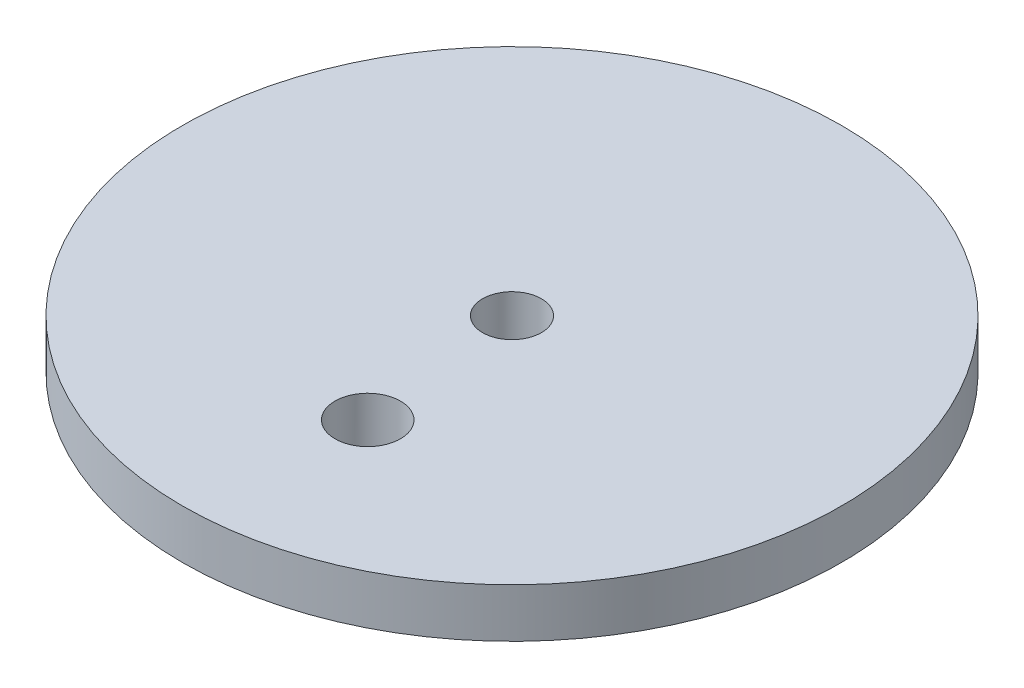
ISO-10303-21;
HEADER;
FILE_DESCRIPTION(('STEP AP214'),'2;1');
FILE_NAME('part.step','',(''),(''),'','','');
FILE_SCHEMA(('AUTOMOTIVE_DESIGN { 1 0 10303 214 1 1 1 1 }'));
ENDSEC;
DATA;
#1=APPLICATION_CONTEXT('core data for automotive mechanical design processes');
#2=APPLICATION_PROTOCOL_DEFINITION('international standard','automotive_design',2000,#1);
#3=PRODUCT_CONTEXT('',#1,'mechanical');
#4=PRODUCT('Part','Part','',(#3));
#5=PRODUCT_RELATED_PRODUCT_CATEGORY('part','',(#4));
#6=PRODUCT_DEFINITION_FORMATION('','',#4);
#7=PRODUCT_DEFINITION_CONTEXT('part definition',#1,'design');
#8=PRODUCT_DEFINITION('design','',#6,#7);
#9=PRODUCT_DEFINITION_SHAPE('','',#8);
#10=(LENGTH_UNIT() NAMED_UNIT(*) SI_UNIT(.MILLI.,.METRE.));
#11=(NAMED_UNIT(*) PLANE_ANGLE_UNIT() SI_UNIT($,.RADIAN.));
#12=(NAMED_UNIT(*) SI_UNIT($,.STERADIAN.) SOLID_ANGLE_UNIT());
#13=UNCERTAINTY_MEASURE_WITH_UNIT(LENGTH_MEASURE(1.E-05),#10,'distance_accuracy_value','');
#14=(GEOMETRIC_REPRESENTATION_CONTEXT(3) GLOBAL_UNCERTAINTY_ASSIGNED_CONTEXT((#13)) GLOBAL_UNIT_ASSIGNED_CONTEXT((#10,
#11,#12)) REPRESENTATION_CONTEXT('',''));
#15=CARTESIAN_POINT('',(0.,0.,0.));
#16=DIRECTION('',(0.,0.,1.));
#17=DIRECTION('',(1.,0.,0.));
#18=AXIS2_PLACEMENT_3D('',#15,#16,#17);
#19=CARTESIAN_POINT('',(20.1648867434263,9.39810199171115,0.));
#20=DIRECTION('',(0.,1.,0.));
#21=DIRECTION('',(0.,0.,1.));
#22=AXIS2_PLACEMENT_3D('',#19,#20,#21);
#23=PLANE('',#22);
#24=CARTESIAN_POINT('',(1.10990845996003,9.39810199171115,9.93821428680772));
#25=DIRECTION('',(0.,1.,0.));
#26=DIRECTION('',(0.,0.,1.));
#27=AXIS2_PLACEMENT_3D('',#24,#25,#26);
#28=CIRCLE('',#27,2.00310616677559);
#29=CARTESIAN_POINT('',(1.10990845996003,9.39810199171115,11.9413204535833));
#30=VERTEX_POINT('',#29);
#31=EDGE_CURVE('E50',#30,#30,#28,.T.);
#32=ORIENTED_EDGE('',*,*,#31,.F.);
#33=EDGE_LOOP('',(#32));
#34=FACE_BOUND('',#33,.T.);
#35=CARTESIAN_POINT('',(0.,9.39810199171116,0.));
#36=DIRECTION('',(0.,-1.,0.));
#37=DIRECTION('',(0.,0.,-1.));
#38=AXIS2_PLACEMENT_3D('',#35,#36,#37);
#39=CIRCLE('',#38,1.8);
#40=CARTESIAN_POINT('',(0.,9.39810199171116,-1.8));
#41=VERTEX_POINT('',#40);
#42=EDGE_CURVE('E10',#41,#41,#39,.T.);
#43=ORIENTED_EDGE('',*,*,#42,.T.);
#44=EDGE_LOOP('',(#43));
#45=FACE_BOUND('',#44,.T.);
#46=CARTESIAN_POINT('',(0.,9.39810199171114,0.));
#47=DIRECTION('',(0.,-1.,0.));
#48=DIRECTION('',(0.,0.,-1.));
#49=AXIS2_PLACEMENT_3D('',#46,#47,#48);
#50=CIRCLE('',#49,20.1648867434263);
#51=CARTESIAN_POINT('',(0.,9.39810199171114,-20.1648867434263));
#52=VERTEX_POINT('',#51);
#53=EDGE_CURVE('E47',#52,#52,#50,.T.);
#54=ORIENTED_EDGE('',*,*,#53,.F.);
#55=EDGE_LOOP('',(#54));
#56=FACE_BOUND('',#55,.T.);
#57=ADVANCED_FACE('F31',(#34,#45,#56),#23,.T.);
#58=CARTESIAN_POINT('',(0.,9.39810199171116,0.));
#59=DIRECTION('',(0.,-1.,0.));
#60=DIRECTION('',(0.,0.,-1.));
#61=AXIS2_PLACEMENT_3D('',#58,#59,#60);
#62=CYLINDRICAL_SURFACE('',#61,1.8);
#63=CARTESIAN_POINT('',(0.,6.39810199171116,0.));
#64=DIRECTION('',(0.,-1.,0.));
#65=DIRECTION('',(0.,0.,-1.));
#66=AXIS2_PLACEMENT_3D('',#63,#64,#65);
#67=CIRCLE('',#66,1.8);
#68=CARTESIAN_POINT('',(0.,6.39810199171116,-1.8));
#69=VERTEX_POINT('',#68);
#70=EDGE_CURVE('E38',#69,#69,#67,.T.);
#71=ORIENTED_EDGE('',*,*,#70,.T.);
#72=EDGE_LOOP('',(#71));
#73=FACE_BOUND('',#72,.T.);
#74=ORIENTED_EDGE('',*,*,#42,.F.);
#75=EDGE_LOOP('',(#74));
#76=FACE_BOUND('',#75,.T.);
#77=ADVANCED_FACE('F63',(#73,#76),#62,.F.);
#78=CARTESIAN_POINT('',(1.8,6.39810199171116,0.));
#79=DIRECTION('',(0.,-1.,0.));
#80=DIRECTION('',(0.,0.,-1.));
#81=AXIS2_PLACEMENT_3D('',#78,#79,#80);
#82=PLANE('',#81);
#83=CARTESIAN_POINT('',(1.10990845996003,6.39810199171116,9.93821428680772));
#84=DIRECTION('',(0.,-1.,0.));
#85=DIRECTION('',(0.,0.,-1.));
#86=AXIS2_PLACEMENT_3D('',#83,#84,#85);
#87=CIRCLE('',#86,2.00310616677559);
#88=CARTESIAN_POINT('',(1.10990845996003,6.39810199171116,7.93510812003213));
#89=VERTEX_POINT('',#88);
#90=EDGE_CURVE('E34',#89,#89,#87,.T.);
#91=ORIENTED_EDGE('',*,*,#90,.F.);
#92=EDGE_LOOP('',(#91));
#93=FACE_BOUND('',#92,.T.);
#94=CARTESIAN_POINT('',(0.,6.39810199171115,0.));
#95=DIRECTION('',(0.,-1.,0.));
#96=DIRECTION('',(0.,0.,-1.));
#97=AXIS2_PLACEMENT_3D('',#94,#95,#96);
#98=CIRCLE('',#97,20.1648867434263);
#99=CARTESIAN_POINT('',(0.,6.39810199171115,-20.1648867434263));
#100=VERTEX_POINT('',#99);
#101=EDGE_CURVE('E42',#100,#100,#98,.T.);
#102=ORIENTED_EDGE('',*,*,#101,.T.);
#103=EDGE_LOOP('',(#102));
#104=FACE_BOUND('',#103,.T.);
#105=ORIENTED_EDGE('',*,*,#70,.F.);
#106=EDGE_LOOP('',(#105));
#107=FACE_BOUND('',#106,.T.);
#108=ADVANCED_FACE('F59',(#93,#104,#107),#82,.T.);
#109=CARTESIAN_POINT('',(0.,9.39810199171116,0.));
#110=DIRECTION('',(0.,-1.,0.));
#111=DIRECTION('',(0.,0.,-1.));
#112=AXIS2_PLACEMENT_3D('',#109,#110,#111);
#113=CYLINDRICAL_SURFACE('',#112,20.1648867434263);
#114=ORIENTED_EDGE('',*,*,#53,.T.);
#115=EDGE_LOOP('',(#114));
#116=FACE_BOUND('',#115,.T.);
#117=ORIENTED_EDGE('',*,*,#101,.F.);
#118=EDGE_LOOP('',(#117));
#119=FACE_BOUND('',#118,.T.);
#120=ADVANCED_FACE('F62',(#116,#119),#113,.T.);
#121=CARTESIAN_POINT('',(1.10990845996003,-0.601898008288851,9.93821428680772));
#122=DIRECTION('',(0.,1.,0.));
#123=DIRECTION('',(0.,0.,1.));
#124=AXIS2_PLACEMENT_3D('',#121,#122,#123);
#125=CYLINDRICAL_SURFACE('',#124,2.00310616677559);
#126=ORIENTED_EDGE('',*,*,#90,.T.);
#127=EDGE_LOOP('',(#126));
#128=FACE_BOUND('',#127,.T.);
#129=ORIENTED_EDGE('',*,*,#31,.T.);
#130=EDGE_LOOP('',(#129));
#131=FACE_BOUND('',#130,.T.);
#132=ADVANCED_FACE('F57',(#128,#131),#125,.F.);
#133=CLOSED_SHELL('',(#57,#77,#108,#120,#132));
#134=MANIFOLD_SOLID_BREP('B2',#133);
#135=ADVANCED_BREP_SHAPE_REPRESENTATION('',(#18,#134),#14);
#136=SHAPE_DEFINITION_REPRESENTATION(#9,#135);
ENDSEC;
END-ISO-10303-21;
